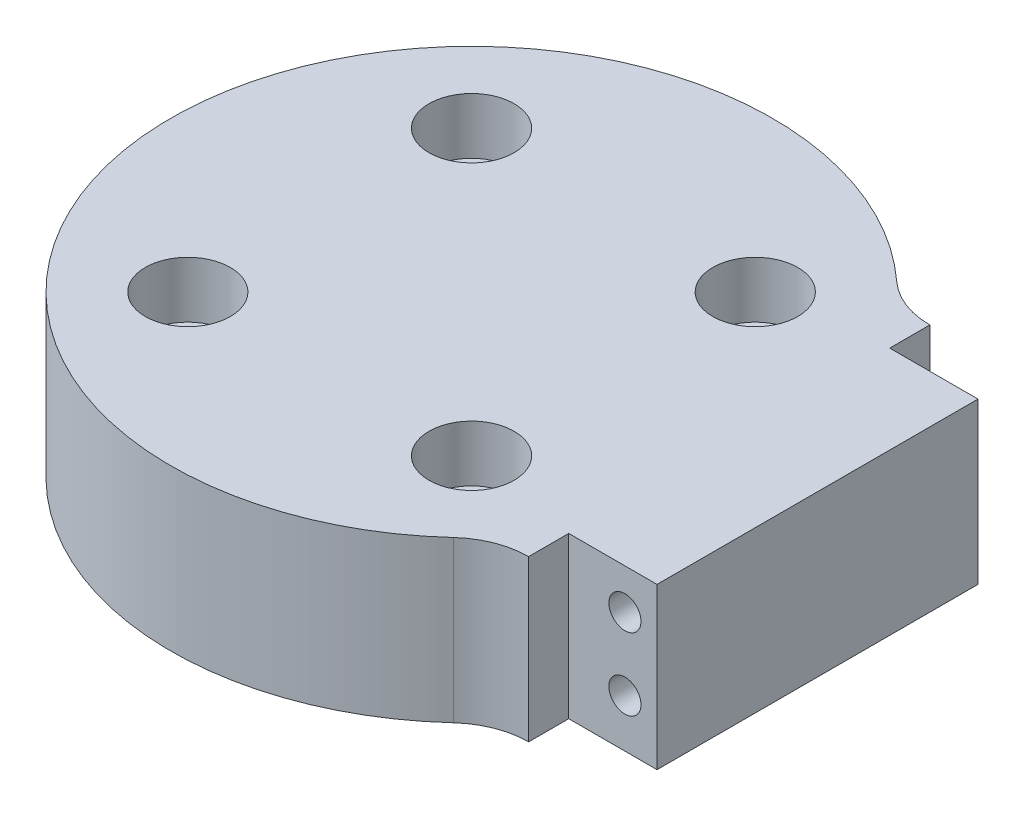
ISO-10303-21;
HEADER;
FILE_DESCRIPTION(('STEP AP214'),'2;1');
FILE_NAME('part.step','',(''),(''),'','','');
FILE_SCHEMA(('AUTOMOTIVE_DESIGN { 1 0 10303 214 1 1 1 1 }'));
ENDSEC;
DATA;
#1=APPLICATION_CONTEXT('core data for automotive mechanical design processes');
#2=APPLICATION_PROTOCOL_DEFINITION('international standard','automotive_design',2000,#1);
#3=PRODUCT_CONTEXT('',#1,'mechanical');
#4=PRODUCT('Part','Part','',(#3));
#5=PRODUCT_RELATED_PRODUCT_CATEGORY('part','',(#4));
#6=PRODUCT_DEFINITION_FORMATION('','',#4);
#7=PRODUCT_DEFINITION_CONTEXT('part definition',#1,'design');
#8=PRODUCT_DEFINITION('design','',#6,#7);
#9=PRODUCT_DEFINITION_SHAPE('','',#8);
#10=(LENGTH_UNIT() NAMED_UNIT(*) SI_UNIT(.MILLI.,.METRE.));
#11=(NAMED_UNIT(*) PLANE_ANGLE_UNIT() SI_UNIT($,.RADIAN.));
#12=(NAMED_UNIT(*) SI_UNIT($,.STERADIAN.) SOLID_ANGLE_UNIT());
#13=UNCERTAINTY_MEASURE_WITH_UNIT(LENGTH_MEASURE(1.E-05),#10,'distance_accuracy_value','');
#14=(GEOMETRIC_REPRESENTATION_CONTEXT(3) GLOBAL_UNCERTAINTY_ASSIGNED_CONTEXT((#13)) GLOBAL_UNIT_ASSIGNED_CONTEXT((#10,
#11,#12)) REPRESENTATION_CONTEXT('',''));
#15=CARTESIAN_POINT('',(0.,0.,0.));
#16=DIRECTION('',(0.,0.,1.));
#17=DIRECTION('',(1.,0.,0.));
#18=AXIS2_PLACEMENT_3D('',#15,#16,#17);
#19=CARTESIAN_POINT('',(-70.3869185533372,0.,0.));
#20=DIRECTION('',(-1.,0.,0.));
#21=DIRECTION('',(0.,0.,1.));
#22=AXIS2_PLACEMENT_3D('',#19,#20,#21);
#23=PLANE('',#22);
#24=DIRECTION('',(0.,-1.,0.));
#25=VECTOR('',#24,1.);
#26=CARTESIAN_POINT('',(-70.3869185533372,80.,20.));
#27=LINE('',#26,#25);
#28=CARTESIAN_POINT('',(-70.3869185533371,80.,20.));
#29=VERTEX_POINT('',#28);
#30=CARTESIAN_POINT('',(-70.3869185533372,60.,20.));
#31=VERTEX_POINT('',#30);
#32=EDGE_CURVE('E137',#29,#31,#27,.T.);
#33=ORIENTED_EDGE('',*,*,#32,.F.);
#34=DIRECTION('',(0.,0.,1.));
#35=VECTOR('',#34,1.);
#36=CARTESIAN_POINT('',(-70.3869185533371,80.,39.));
#37=LINE('',#36,#35);
#38=CARTESIAN_POINT('',(-70.3869185533372,80.,25.));
#39=VERTEX_POINT('',#38);
#40=EDGE_CURVE('E138',#29,#39,#37,.T.);
#41=ORIENTED_EDGE('',*,*,#40,.T.);
#42=DIRECTION('',(0.,1.,0.));
#43=VECTOR('',#42,1.);
#44=CARTESIAN_POINT('',(-70.3869185533372,80.,25.));
#45=LINE('',#44,#43);
#46=CARTESIAN_POINT('',(-70.3869185533372,60.,25.));
#47=VERTEX_POINT('',#46);
#48=EDGE_CURVE('E186',#39,#47,#45,.F.);
#49=ORIENTED_EDGE('',*,*,#48,.T.);
#50=DIRECTION('',(0.,0.,1.));
#51=VECTOR('',#50,1.);
#52=CARTESIAN_POINT('',(-70.3869185533372,60.,-25.));
#53=LINE('',#52,#51);
#54=EDGE_CURVE('E65',#31,#47,#53,.T.);
#55=ORIENTED_EDGE('',*,*,#54,.F.);
#56=EDGE_LOOP('',(#33,#41,#49,#55));
#57=FACE_BOUND('',#56,.T.);
#58=ADVANCED_FACE('F48',(#57),#23,.F.);
#59=DIRECTION('',(0.,1.,0.));
#60=VECTOR('',#59,1.);
#61=CARTESIAN_POINT('',(-70.3869185533372,80.,-20.));
#62=LINE('',#61,#60);
#63=CARTESIAN_POINT('',(-70.3869185533372,60.,-20.));
#64=VERTEX_POINT('',#63);
#65=CARTESIAN_POINT('',(-70.3869185533372,80.,-20.));
#66=VERTEX_POINT('',#65);
#67=EDGE_CURVE('E73',#64,#66,#62,.T.);
#68=ORIENTED_EDGE('',*,*,#67,.F.);
#69=CARTESIAN_POINT('',(-70.3869185533372,60.,-25.));
#70=VERTEX_POINT('',#69);
#71=EDGE_CURVE('E146',#70,#64,#53,.T.);
#72=ORIENTED_EDGE('',*,*,#71,.F.);
#73=DIRECTION('',(0.,1.,0.));
#74=VECTOR('',#73,1.);
#75=CARTESIAN_POINT('',(-70.3869185533372,80.,-25.));
#76=LINE('',#75,#74);
#77=CARTESIAN_POINT('',(-70.3869185533372,80.,-25.));
#78=VERTEX_POINT('',#77);
#79=EDGE_CURVE('E176',#70,#78,#76,.T.);
#80=ORIENTED_EDGE('',*,*,#79,.T.);
#81=EDGE_CURVE('E140',#78,#66,#37,.T.);
#82=ORIENTED_EDGE('',*,*,#81,.T.);
#83=EDGE_LOOP('',(#68,#72,#80,#82));
#84=FACE_BOUND('',#83,.T.);
#85=ADVANCED_FACE('F220',(#84),#23,.F.);
#86=CARTESIAN_POINT('',(-120.177669529664,-5.,-17.6776695296637));
#87=DIRECTION('',(0.,1.,0.));
#88=DIRECTION('',(0.,0.,1.));
#89=AXIS2_PLACEMENT_3D('',#86,#87,#88);
#90=CYLINDRICAL_SURFACE('',#89,3.25000000000001);
#91=CARTESIAN_POINT('',(-120.177669529664,60.,-17.6776695296637));
#92=DIRECTION('',(0.,1.,0.));
#93=DIRECTION('',(0.,0.,1.));
#94=AXIS2_PLACEMENT_3D('',#91,#92,#93);
#95=CIRCLE('',#94,3.25000000000001);
#96=CARTESIAN_POINT('',(-120.177669529664,60.,-14.4276695296637));
#97=VERTEX_POINT('',#96);
#98=EDGE_CURVE('E193',#97,#97,#95,.T.);
#99=ORIENTED_EDGE('',*,*,#98,.F.);
#100=EDGE_LOOP('',(#99));
#101=FACE_BOUND('',#100,.T.);
#102=CARTESIAN_POINT('',(-120.177669529664,73.,-17.6776695296637));
#103=DIRECTION('',(0.,1.,0.));
#104=DIRECTION('',(0.,0.,1.));
#105=AXIS2_PLACEMENT_3D('',#102,#103,#104);
#106=CIRCLE('',#105,3.25000000000001);
#107=CARTESIAN_POINT('',(-120.177669529664,73.,-14.4276695296637));
#108=VERTEX_POINT('',#107);
#109=EDGE_CURVE('E52',#108,#108,#106,.F.);
#110=ORIENTED_EDGE('',*,*,#109,.F.);
#111=EDGE_LOOP('',(#110));
#112=FACE_BOUND('',#111,.T.);
#113=ADVANCED_FACE('F217',(#101,#112),#90,.F.);
#114=CARTESIAN_POINT('',(-120.177669529664,-5.,17.6776695296637));
#115=DIRECTION('',(0.,1.,0.));
#116=DIRECTION('',(0.,0.,1.));
#117=AXIS2_PLACEMENT_3D('',#114,#115,#116);
#118=CYLINDRICAL_SURFACE('',#117,3.25000000000001);
#119=CARTESIAN_POINT('',(-120.177669529664,60.,17.6776695296637));
#120=DIRECTION('',(0.,1.,0.));
#121=DIRECTION('',(0.,0.,1.));
#122=AXIS2_PLACEMENT_3D('',#119,#120,#121);
#123=CIRCLE('',#122,3.25000000000001);
#124=CARTESIAN_POINT('',(-120.177669529664,60.,20.9276695296637));
#125=VERTEX_POINT('',#124);
#126=EDGE_CURVE('E196',#125,#125,#123,.T.);
#127=ORIENTED_EDGE('',*,*,#126,.F.);
#128=EDGE_LOOP('',(#127));
#129=FACE_BOUND('',#128,.T.);
#130=CARTESIAN_POINT('',(-120.177669529664,73.,17.6776695296637));
#131=DIRECTION('',(0.,1.,0.));
#132=DIRECTION('',(0.,0.,1.));
#133=AXIS2_PLACEMENT_3D('',#130,#131,#132);
#134=CIRCLE('',#133,3.25000000000001);
#135=CARTESIAN_POINT('',(-120.177669529664,73.,20.9276695296637));
#136=VERTEX_POINT('',#135);
#137=EDGE_CURVE('E208',#136,#136,#134,.F.);
#138=ORIENTED_EDGE('',*,*,#137,.F.);
#139=EDGE_LOOP('',(#138));
#140=FACE_BOUND('',#139,.T.);
#141=ADVANCED_FACE('F219',(#129,#140),#118,.F.);
#142=CARTESIAN_POINT('',(-84.8223304703363,-5.,17.6776695296637));
#143=DIRECTION('',(0.,1.,0.));
#144=DIRECTION('',(0.,0.,1.));
#145=AXIS2_PLACEMENT_3D('',#142,#143,#144);
#146=CYLINDRICAL_SURFACE('',#145,3.25000000000001);
#147=CARTESIAN_POINT('',(-84.8223304703363,60.,17.6776695296637));
#148=DIRECTION('',(0.,1.,0.));
#149=DIRECTION('',(0.,0.,1.));
#150=AXIS2_PLACEMENT_3D('',#147,#148,#149);
#151=CIRCLE('',#150,3.25000000000001);
#152=CARTESIAN_POINT('',(-84.8223304703363,60.,20.9276695296637));
#153=VERTEX_POINT('',#152);
#154=EDGE_CURVE('E199',#153,#153,#151,.T.);
#155=ORIENTED_EDGE('',*,*,#154,.F.);
#156=EDGE_LOOP('',(#155));
#157=FACE_BOUND('',#156,.T.);
#158=CARTESIAN_POINT('',(-84.8223304703363,73.,17.6776695296637));
#159=DIRECTION('',(0.,1.,0.));
#160=DIRECTION('',(0.,0.,1.));
#161=AXIS2_PLACEMENT_3D('',#158,#159,#160);
#162=CIRCLE('',#161,3.25000000000001);
#163=CARTESIAN_POINT('',(-84.8223304703363,73.,20.9276695296637));
#164=VERTEX_POINT('',#163);
#165=EDGE_CURVE('E206',#164,#164,#162,.F.);
#166=ORIENTED_EDGE('',*,*,#165,.F.);
#167=EDGE_LOOP('',(#166));
#168=FACE_BOUND('',#167,.T.);
#169=ADVANCED_FACE('F226',(#157,#168),#146,.F.);
#170=CARTESIAN_POINT('',(-84.8223304703363,-5.,-17.6776695296637));
#171=DIRECTION('',(0.,1.,0.));
#172=DIRECTION('',(0.,0.,1.));
#173=AXIS2_PLACEMENT_3D('',#170,#171,#172);
#174=CYLINDRICAL_SURFACE('',#173,3.25000000000001);
#175=CARTESIAN_POINT('',(-84.8223304703363,60.,-17.6776695296637));
#176=DIRECTION('',(0.,1.,0.));
#177=DIRECTION('',(0.,0.,1.));
#178=AXIS2_PLACEMENT_3D('',#175,#176,#177);
#179=CIRCLE('',#178,3.25000000000001);
#180=CARTESIAN_POINT('',(-84.8223304703363,60.,-14.4276695296637));
#181=VERTEX_POINT('',#180);
#182=EDGE_CURVE('E180',#181,#181,#179,.T.);
#183=ORIENTED_EDGE('',*,*,#182,.F.);
#184=EDGE_LOOP('',(#183));
#185=FACE_BOUND('',#184,.T.);
#186=CARTESIAN_POINT('',(-84.8223304703363,73.,-17.6776695296637));
#187=DIRECTION('',(0.,1.,0.));
#188=DIRECTION('',(0.,0.,1.));
#189=AXIS2_PLACEMENT_3D('',#186,#187,#188);
#190=CIRCLE('',#189,3.25000000000001);
#191=CARTESIAN_POINT('',(-84.8223304703363,73.,-14.4276695296637));
#192=VERTEX_POINT('',#191);
#193=EDGE_CURVE('E170',#192,#192,#190,.F.);
#194=ORIENTED_EDGE('',*,*,#193,.F.);
#195=EDGE_LOOP('',(#194));
#196=FACE_BOUND('',#195,.T.);
#197=ADVANCED_FACE('F273',(#185,#196),#174,.F.);
#198=CARTESIAN_POINT('',(0.,80.,0.));
#199=DIRECTION('',(0.,1.,0.));
#200=DIRECTION('',(0.,0.,1.));
#201=AXIS2_PLACEMENT_3D('',#198,#199,#200);
#202=PLANE('',#201);
#203=ORIENTED_EDGE('',*,*,#81,.F.);
#204=CARTESIAN_POINT('',(-70.3869185533372,80.,-35.));
#205=DIRECTION('',(0.,1.,0.));
#206=DIRECTION('',(0.,0.,1.));
#207=AXIS2_PLACEMENT_3D('',#204,#205,#206);
#208=CIRCLE('',#207,10.);
#209=CARTESIAN_POINT('',(-77.1475672789504,80.,-27.6315789473684));
#210=VERTEX_POINT('',#209);
#211=EDGE_CURVE('E188',#78,#210,#208,.F.);
#212=ORIENTED_EDGE('',*,*,#211,.T.);
#213=CARTESIAN_POINT('',(-102.5,80.,0.));
#214=DIRECTION('',(0.,1.,0.));
#215=DIRECTION('',(0.,0.,1.));
#216=AXIS2_PLACEMENT_3D('',#213,#214,#215);
#217=CIRCLE('',#216,37.5);
#218=CARTESIAN_POINT('',(-77.1475672789504,80.,27.6315789473684));
#219=VERTEX_POINT('',#218);
#220=EDGE_CURVE('E177',#210,#219,#217,.T.);
#221=ORIENTED_EDGE('',*,*,#220,.T.);
#222=CARTESIAN_POINT('',(-70.3869185533372,80.,35.));
#223=DIRECTION('',(0.,1.,0.));
#224=DIRECTION('',(0.,0.,1.));
#225=AXIS2_PLACEMENT_3D('',#222,#223,#224);
#226=CIRCLE('',#225,10.);
#227=EDGE_CURVE('E12',#219,#39,#226,.F.);
#228=ORIENTED_EDGE('',*,*,#227,.T.);
#229=ORIENTED_EDGE('',*,*,#40,.F.);
#230=DIRECTION('',(-1.,0.,0.));
#231=VECTOR('',#230,1.);
#232=CARTESIAN_POINT('',(-59.3869185533372,80.,20.));
#233=LINE('',#232,#231);
#234=CARTESIAN_POINT('',(-59.3869185533372,80.,20.));
#235=VERTEX_POINT('',#234);
#236=EDGE_CURVE('E334',#235,#29,#233,.T.);
#237=ORIENTED_EDGE('',*,*,#236,.F.);
#238=DIRECTION('',(0.,0.,1.));
#239=VECTOR('',#238,1.);
#240=CARTESIAN_POINT('',(-59.3869185533372,80.,20.));
#241=LINE('',#240,#239);
#242=CARTESIAN_POINT('',(-59.3869185533372,80.,-20.));
#243=VERTEX_POINT('',#242);
#244=EDGE_CURVE('E131',#243,#235,#241,.T.);
#245=ORIENTED_EDGE('',*,*,#244,.F.);
#246=DIRECTION('',(-1.,0.,0.));
#247=VECTOR('',#246,1.);
#248=CARTESIAN_POINT('',(-59.3869185533372,80.,-20.));
#249=LINE('',#248,#247);
#250=EDGE_CURVE('E142',#243,#66,#249,.T.);
#251=ORIENTED_EDGE('',*,*,#250,.T.);
#252=EDGE_LOOP('',(#203,#212,#221,#228,#229,#237,#245,#251));
#253=FACE_BOUND('',#252,.T.);
#254=CARTESIAN_POINT('',(-84.8223304703363,80.,-17.6776695296637));
#255=DIRECTION('',(0.,1.,0.));
#256=DIRECTION('',(0.,0.,1.));
#257=AXIS2_PLACEMENT_3D('',#254,#255,#256);
#258=CIRCLE('',#257,5.3);
#259=CARTESIAN_POINT('',(-84.8223304703363,80.,-12.3776695296637));
#260=VERTEX_POINT('',#259);
#261=EDGE_CURVE('E148',#260,#260,#258,.T.);
#262=ORIENTED_EDGE('',*,*,#261,.F.);
#263=EDGE_LOOP('',(#262));
#264=FACE_BOUND('',#263,.T.);
#265=CARTESIAN_POINT('',(-84.8223304703363,80.,17.6776695296637));
#266=DIRECTION('',(0.,1.,0.));
#267=DIRECTION('',(0.,0.,1.));
#268=AXIS2_PLACEMENT_3D('',#265,#266,#267);
#269=CIRCLE('',#268,5.3);
#270=CARTESIAN_POINT('',(-84.8223304703363,80.,22.9776695296637));
#271=VERTEX_POINT('',#270);
#272=EDGE_CURVE('E159',#271,#271,#269,.T.);
#273=ORIENTED_EDGE('',*,*,#272,.F.);
#274=EDGE_LOOP('',(#273));
#275=FACE_BOUND('',#274,.T.);
#276=CARTESIAN_POINT('',(-120.177669529664,80.,17.6776695296637));
#277=DIRECTION('',(0.,1.,0.));
#278=DIRECTION('',(0.,0.,1.));
#279=AXIS2_PLACEMENT_3D('',#276,#277,#278);
#280=CIRCLE('',#279,5.3);
#281=CARTESIAN_POINT('',(-120.177669529664,80.,22.9776695296637));
#282=VERTEX_POINT('',#281);
#283=EDGE_CURVE('E153',#282,#282,#280,.T.);
#284=ORIENTED_EDGE('',*,*,#283,.F.);
#285=EDGE_LOOP('',(#284));
#286=FACE_BOUND('',#285,.T.);
#287=CARTESIAN_POINT('',(-120.177669529664,80.,-17.6776695296637));
#288=DIRECTION('',(0.,1.,0.));
#289=DIRECTION('',(0.,0.,1.));
#290=AXIS2_PLACEMENT_3D('',#287,#288,#289);
#291=CIRCLE('',#290,5.3);
#292=CARTESIAN_POINT('',(-120.177669529664,80.,-12.3776695296637));
#293=VERTEX_POINT('',#292);
#294=EDGE_CURVE('E152',#293,#293,#291,.T.);
#295=ORIENTED_EDGE('',*,*,#294,.F.);
#296=EDGE_LOOP('',(#295));
#297=FACE_BOUND('',#296,.T.);
#298=ADVANCED_FACE('F276',(#253,#264,#275,#286,#297),#202,.T.);
#299=CARTESIAN_POINT('',(-140.,60.,-25.));
#300=DIRECTION('',(0.,1.,0.));
#301=DIRECTION('',(0.,0.,1.));
#302=AXIS2_PLACEMENT_3D('',#299,#300,#301);
#303=PLANE('',#302);
#304=ORIENTED_EDGE('',*,*,#182,.T.);
#305=EDGE_LOOP('',(#304));
#306=FACE_BOUND('',#305,.T.);
#307=ORIENTED_EDGE('',*,*,#154,.T.);
#308=EDGE_LOOP('',(#307));
#309=FACE_BOUND('',#308,.T.);
#310=ORIENTED_EDGE('',*,*,#126,.T.);
#311=EDGE_LOOP('',(#310));
#312=FACE_BOUND('',#311,.T.);
#313=ORIENTED_EDGE('',*,*,#98,.T.);
#314=EDGE_LOOP('',(#313));
#315=FACE_BOUND('',#314,.T.);
#316=CARTESIAN_POINT('',(-70.3869185533372,60.,-35.));
#317=DIRECTION('',(0.,1.,0.));
#318=DIRECTION('',(0.,0.,1.));
#319=AXIS2_PLACEMENT_3D('',#316,#317,#318);
#320=CIRCLE('',#319,10.);
#321=CARTESIAN_POINT('',(-77.1475672789504,60.,-27.6315789473684));
#322=VERTEX_POINT('',#321);
#323=EDGE_CURVE('E190',#322,#70,#320,.T.);
#324=ORIENTED_EDGE('',*,*,#323,.T.);
#325=ORIENTED_EDGE('',*,*,#71,.T.);
#326=DIRECTION('',(-1.,0.,0.));
#327=VECTOR('',#326,1.);
#328=CARTESIAN_POINT('',(-59.3869185533372,60.,-20.));
#329=LINE('',#328,#327);
#330=CARTESIAN_POINT('',(-59.3869185533372,60.,-20.));
#331=VERTEX_POINT('',#330);
#332=EDGE_CURVE('E122',#331,#64,#329,.T.);
#333=ORIENTED_EDGE('',*,*,#332,.F.);
#334=DIRECTION('',(0.,0.,-1.));
#335=VECTOR('',#334,1.);
#336=CARTESIAN_POINT('',(-59.3869185533372,60.,20.));
#337=LINE('',#336,#335);
#338=CARTESIAN_POINT('',(-59.3869185533372,60.,20.));
#339=VERTEX_POINT('',#338);
#340=EDGE_CURVE('E114',#339,#331,#337,.T.);
#341=ORIENTED_EDGE('',*,*,#340,.F.);
#342=DIRECTION('',(-1.,0.,0.));
#343=VECTOR('',#342,1.);
#344=CARTESIAN_POINT('',(-59.3869185533372,60.,20.));
#345=LINE('',#344,#343);
#346=EDGE_CURVE('E119',#339,#31,#345,.T.);
#347=ORIENTED_EDGE('',*,*,#346,.T.);
#348=ORIENTED_EDGE('',*,*,#54,.T.);
#349=CARTESIAN_POINT('',(-70.3869185533372,60.,35.));
#350=DIRECTION('',(0.,1.,0.));
#351=DIRECTION('',(0.,0.,1.));
#352=AXIS2_PLACEMENT_3D('',#349,#350,#351);
#353=CIRCLE('',#352,10.);
#354=CARTESIAN_POINT('',(-77.1475672789504,60.,27.6315789473684));
#355=VERTEX_POINT('',#354);
#356=EDGE_CURVE('E57',#47,#355,#353,.T.);
#357=ORIENTED_EDGE('',*,*,#356,.T.);
#358=CARTESIAN_POINT('',(-102.5,60.,0.));
#359=DIRECTION('',(0.,1.,0.));
#360=DIRECTION('',(0.,0.,1.));
#361=AXIS2_PLACEMENT_3D('',#358,#359,#360);
#362=CIRCLE('',#361,37.5);
#363=EDGE_CURVE('E173',#355,#322,#362,.F.);
#364=ORIENTED_EDGE('',*,*,#363,.T.);
#365=EDGE_LOOP('',(#324,#325,#333,#341,#347,#348,#357,#364));
#366=FACE_BOUND('',#365,.T.);
#367=ADVANCED_FACE('F117',(#306,#309,#312,#315,#366),#303,.F.);
#368=CARTESIAN_POINT('',(-102.5,-46.0660171779822,0.));
#369=DIRECTION('',(0.,1.,0.));
#370=DIRECTION('',(0.,0.,1.));
#371=AXIS2_PLACEMENT_3D('',#368,#369,#370);
#372=CYLINDRICAL_SURFACE('',#371,37.5);
#373=ORIENTED_EDGE('',*,*,#220,.F.);
#374=DIRECTION('',(0.,1.,0.));
#375=VECTOR('',#374,1.);
#376=CARTESIAN_POINT('',(-77.1475672789504,-46.0660171779822,-27.6315789473684));
#377=LINE('',#376,#375);
#378=EDGE_CURVE('E184',#210,#322,#377,.F.);
#379=ORIENTED_EDGE('',*,*,#378,.T.);
#380=ORIENTED_EDGE('',*,*,#363,.F.);
#381=DIRECTION('',(0.,1.,0.));
#382=VECTOR('',#381,1.);
#383=CARTESIAN_POINT('',(-77.1475672789504,-46.0660171779822,27.6315789473684));
#384=LINE('',#383,#382);
#385=EDGE_CURVE('E182',#355,#219,#384,.T.);
#386=ORIENTED_EDGE('',*,*,#385,.T.);
#387=EDGE_LOOP('',(#373,#379,#380,#386));
#388=FACE_BOUND('',#387,.T.);
#389=ADVANCED_FACE('F291',(#388),#372,.T.);
#390=CARTESIAN_POINT('',(-70.3869185533372,-46.0660171779822,-35.));
#391=DIRECTION('',(0.,1.,0.));
#392=DIRECTION('',(0.,0.,1.));
#393=AXIS2_PLACEMENT_3D('',#390,#391,#392);
#394=CYLINDRICAL_SURFACE('',#393,10.);
#395=ORIENTED_EDGE('',*,*,#323,.F.);
#396=ORIENTED_EDGE('',*,*,#378,.F.);
#397=ORIENTED_EDGE('',*,*,#211,.F.);
#398=ORIENTED_EDGE('',*,*,#79,.F.);
#399=EDGE_LOOP('',(#395,#396,#397,#398));
#400=FACE_BOUND('',#399,.T.);
#401=ADVANCED_FACE('F304',(#400),#394,.F.);
#402=CARTESIAN_POINT('',(-70.3869185533372,-46.0660171779822,35.));
#403=DIRECTION('',(0.,1.,0.));
#404=DIRECTION('',(0.,0.,1.));
#405=AXIS2_PLACEMENT_3D('',#402,#403,#404);
#406=CYLINDRICAL_SURFACE('',#405,10.);
#407=ORIENTED_EDGE('',*,*,#227,.F.);
#408=ORIENTED_EDGE('',*,*,#385,.F.);
#409=ORIENTED_EDGE('',*,*,#356,.F.);
#410=ORIENTED_EDGE('',*,*,#48,.F.);
#411=EDGE_LOOP('',(#407,#408,#409,#410));
#412=FACE_BOUND('',#411,.T.);
#413=ADVANCED_FACE('F50',(#412),#406,.F.);
#414=CARTESIAN_POINT('',(-84.8223304703363,73.,-17.6776695296637));
#415=DIRECTION('',(0.,1.,0.));
#416=DIRECTION('',(0.,0.,1.));
#417=AXIS2_PLACEMENT_3D('',#414,#415,#416);
#418=PLANE('',#417);
#419=CARTESIAN_POINT('',(-84.8223304703363,73.,-17.6776695296637));
#420=DIRECTION('',(0.,1.,0.));
#421=DIRECTION('',(0.,0.,1.));
#422=AXIS2_PLACEMENT_3D('',#419,#420,#421);
#423=CIRCLE('',#422,5.3);
#424=CARTESIAN_POINT('',(-84.8223304703363,73.,-12.3776695296637));
#425=VERTEX_POINT('',#424);
#426=EDGE_CURVE('E162',#425,#425,#423,.T.);
#427=ORIENTED_EDGE('',*,*,#426,.T.);
#428=EDGE_LOOP('',(#427));
#429=FACE_BOUND('',#428,.T.);
#430=ORIENTED_EDGE('',*,*,#193,.T.);
#431=EDGE_LOOP('',(#430));
#432=FACE_BOUND('',#431,.T.);
#433=ADVANCED_FACE('F258',(#429,#432),#418,.T.);
#434=CARTESIAN_POINT('',(-84.8223304703363,73.,-17.6776695296637));
#435=DIRECTION('',(0.,1.,0.));
#436=DIRECTION('',(0.,0.,1.));
#437=AXIS2_PLACEMENT_3D('',#434,#435,#436);
#438=CYLINDRICAL_SURFACE('',#437,5.3);
#439=ORIENTED_EDGE('',*,*,#426,.F.);
#440=EDGE_LOOP('',(#439));
#441=FACE_BOUND('',#440,.T.);
#442=ORIENTED_EDGE('',*,*,#261,.T.);
#443=EDGE_LOOP('',(#442));
#444=FACE_BOUND('',#443,.T.);
#445=ADVANCED_FACE('F253',(#441,#444),#438,.F.);
#446=CARTESIAN_POINT('',(-84.8223304703363,73.,17.6776695296637));
#447=DIRECTION('',(0.,1.,0.));
#448=DIRECTION('',(0.,0.,1.));
#449=AXIS2_PLACEMENT_3D('',#446,#447,#448);
#450=PLANE('',#449);
#451=CARTESIAN_POINT('',(-84.8223304703363,73.,17.6776695296637));
#452=DIRECTION('',(0.,1.,0.));
#453=DIRECTION('',(0.,0.,1.));
#454=AXIS2_PLACEMENT_3D('',#451,#452,#453);
#455=CIRCLE('',#454,5.3);
#456=CARTESIAN_POINT('',(-84.8223304703363,73.,22.9776695296637));
#457=VERTEX_POINT('',#456);
#458=EDGE_CURVE('E156',#457,#457,#455,.T.);
#459=ORIENTED_EDGE('',*,*,#458,.T.);
#460=EDGE_LOOP('',(#459));
#461=FACE_BOUND('',#460,.T.);
#462=ORIENTED_EDGE('',*,*,#165,.T.);
#463=EDGE_LOOP('',(#462));
#464=FACE_BOUND('',#463,.T.);
#465=ADVANCED_FACE('F250',(#461,#464),#450,.T.);
#466=CARTESIAN_POINT('',(-84.8223304703363,73.,17.6776695296637));
#467=DIRECTION('',(0.,1.,0.));
#468=DIRECTION('',(0.,0.,1.));
#469=AXIS2_PLACEMENT_3D('',#466,#467,#468);
#470=CYLINDRICAL_SURFACE('',#469,5.3);
#471=ORIENTED_EDGE('',*,*,#458,.F.);
#472=EDGE_LOOP('',(#471));
#473=FACE_BOUND('',#472,.T.);
#474=ORIENTED_EDGE('',*,*,#272,.T.);
#475=EDGE_LOOP('',(#474));
#476=FACE_BOUND('',#475,.T.);
#477=ADVANCED_FACE('F245',(#473,#476),#470,.F.);
#478=CARTESIAN_POINT('',(-120.177669529664,73.,17.6776695296637));
#479=DIRECTION('',(0.,1.,0.));
#480=DIRECTION('',(0.,0.,1.));
#481=AXIS2_PLACEMENT_3D('',#478,#479,#480);
#482=PLANE('',#481);
#483=CARTESIAN_POINT('',(-120.177669529664,73.,17.6776695296637));
#484=DIRECTION('',(0.,1.,0.));
#485=DIRECTION('',(0.,0.,1.));
#486=AXIS2_PLACEMENT_3D('',#483,#484,#485);
#487=CIRCLE('',#486,5.3);
#488=CARTESIAN_POINT('',(-120.177669529664,73.,22.9776695296637));
#489=VERTEX_POINT('',#488);
#490=EDGE_CURVE('E149',#489,#489,#487,.T.);
#491=ORIENTED_EDGE('',*,*,#490,.T.);
#492=EDGE_LOOP('',(#491));
#493=FACE_BOUND('',#492,.T.);
#494=ORIENTED_EDGE('',*,*,#137,.T.);
#495=EDGE_LOOP('',(#494));
#496=FACE_BOUND('',#495,.T.);
#497=ADVANCED_FACE('F241',(#493,#496),#482,.T.);
#498=CARTESIAN_POINT('',(-120.177669529664,73.,17.6776695296637));
#499=DIRECTION('',(0.,1.,0.));
#500=DIRECTION('',(0.,0.,1.));
#501=AXIS2_PLACEMENT_3D('',#498,#499,#500);
#502=CYLINDRICAL_SURFACE('',#501,5.3);
#503=ORIENTED_EDGE('',*,*,#490,.F.);
#504=EDGE_LOOP('',(#503));
#505=FACE_BOUND('',#504,.T.);
#506=ORIENTED_EDGE('',*,*,#283,.T.);
#507=EDGE_LOOP('',(#506));
#508=FACE_BOUND('',#507,.T.);
#509=ADVANCED_FACE('F244',(#505,#508),#502,.F.);
#510=CARTESIAN_POINT('',(-120.177669529664,73.,-17.6776695296637));
#511=DIRECTION('',(0.,1.,0.));
#512=DIRECTION('',(0.,0.,1.));
#513=AXIS2_PLACEMENT_3D('',#510,#511,#512);
#514=PLANE('',#513);
#515=CARTESIAN_POINT('',(-120.177669529664,73.,-17.6776695296637));
#516=DIRECTION('',(0.,1.,0.));
#517=DIRECTION('',(0.,0.,1.));
#518=AXIS2_PLACEMENT_3D('',#515,#516,#517);
#519=CIRCLE('',#518,5.3);
#520=CARTESIAN_POINT('',(-120.177669529664,73.,-12.3776695296637));
#521=VERTEX_POINT('',#520);
#522=EDGE_CURVE('E167',#521,#521,#519,.T.);
#523=ORIENTED_EDGE('',*,*,#522,.T.);
#524=EDGE_LOOP('',(#523));
#525=FACE_BOUND('',#524,.T.);
#526=ORIENTED_EDGE('',*,*,#109,.T.);
#527=EDGE_LOOP('',(#526));
#528=FACE_BOUND('',#527,.T.);
#529=ADVANCED_FACE('F215',(#525,#528),#514,.T.);
#530=CARTESIAN_POINT('',(-120.177669529664,73.,-17.6776695296637));
#531=DIRECTION('',(0.,1.,0.));
#532=DIRECTION('',(0.,0.,1.));
#533=AXIS2_PLACEMENT_3D('',#530,#531,#532);
#534=CYLINDRICAL_SURFACE('',#533,5.3);
#535=ORIENTED_EDGE('',*,*,#522,.F.);
#536=EDGE_LOOP('',(#535));
#537=FACE_BOUND('',#536,.T.);
#538=ORIENTED_EDGE('',*,*,#294,.T.);
#539=EDGE_LOOP('',(#538));
#540=FACE_BOUND('',#539,.T.);
#541=ADVANCED_FACE('F267',(#537,#540),#534,.F.);
#542=CARTESIAN_POINT('',(-59.3869185533372,80.,20.));
#543=DIRECTION('',(0.,0.,-1.));
#544=DIRECTION('',(0.,1.,0.));
#545=AXIS2_PLACEMENT_3D('',#542,#543,#544);
#546=PLANE('',#545);
#547=CARTESIAN_POINT('',(-63.3869185533372,75.,20.));
#548=DIRECTION('',(0.,0.,1.));
#549=DIRECTION('',(1.,0.,0.));
#550=AXIS2_PLACEMENT_3D('',#547,#548,#549);
#551=CIRCLE('',#550,2.);
#552=CARTESIAN_POINT('',(-61.3869185533372,75.,20.));
#553=VERTEX_POINT('',#552);
#554=EDGE_CURVE('E344',#553,#553,#551,.T.);
#555=ORIENTED_EDGE('',*,*,#554,.F.);
#556=EDGE_LOOP('',(#555));
#557=FACE_BOUND('',#556,.T.);
#558=CARTESIAN_POINT('',(-63.3869185533372,66.,20.));
#559=DIRECTION('',(0.,0.,1.));
#560=DIRECTION('',(1.,0.,0.));
#561=AXIS2_PLACEMENT_3D('',#558,#559,#560);
#562=CIRCLE('',#561,2.);
#563=CARTESIAN_POINT('',(-61.3869185533372,66.,20.));
#564=VERTEX_POINT('',#563);
#565=EDGE_CURVE('E337',#564,#564,#562,.T.);
#566=ORIENTED_EDGE('',*,*,#565,.F.);
#567=EDGE_LOOP('',(#566));
#568=FACE_BOUND('',#567,.T.);
#569=ORIENTED_EDGE('',*,*,#32,.T.);
#570=ORIENTED_EDGE('',*,*,#346,.F.);
#571=DIRECTION('',(0.,-1.,0.));
#572=VECTOR('',#571,1.);
#573=CARTESIAN_POINT('',(-59.3869185533372,80.,20.));
#574=LINE('',#573,#572);
#575=EDGE_CURVE('E126',#235,#339,#574,.T.);
#576=ORIENTED_EDGE('',*,*,#575,.F.);
#577=ORIENTED_EDGE('',*,*,#236,.T.);
#578=EDGE_LOOP('',(#569,#570,#576,#577));
#579=FACE_BOUND('',#578,.T.);
#580=ADVANCED_FACE('F136',(#557,#568,#579),#546,.F.);
#581=CARTESIAN_POINT('',(-59.3869185533372,80.,-20.));
#582=DIRECTION('',(0.,0.,1.));
#583=DIRECTION('',(0.,-1.,0.));
#584=AXIS2_PLACEMENT_3D('',#581,#582,#583);
#585=PLANE('',#584);
#586=CARTESIAN_POINT('',(-63.3869185533372,75.,-20.));
#587=DIRECTION('',(0.,0.,-1.));
#588=DIRECTION('',(0.,1.,0.));
#589=AXIS2_PLACEMENT_3D('',#586,#587,#588);
#590=CIRCLE('',#589,2.);
#591=CARTESIAN_POINT('',(-63.3869185533372,77.,-20.));
#592=VERTEX_POINT('',#591);
#593=EDGE_CURVE('E355',#592,#592,#590,.T.);
#594=ORIENTED_EDGE('',*,*,#593,.F.);
#595=EDGE_LOOP('',(#594));
#596=FACE_BOUND('',#595,.T.);
#597=CARTESIAN_POINT('',(-63.3869185533372,66.,-20.));
#598=DIRECTION('',(0.,0.,-1.));
#599=DIRECTION('',(0.,1.,0.));
#600=AXIS2_PLACEMENT_3D('',#597,#598,#599);
#601=CIRCLE('',#600,2.);
#602=CARTESIAN_POINT('',(-63.3869185533372,68.,-20.));
#603=VERTEX_POINT('',#602);
#604=EDGE_CURVE('E349',#603,#603,#601,.T.);
#605=ORIENTED_EDGE('',*,*,#604,.F.);
#606=EDGE_LOOP('',(#605));
#607=FACE_BOUND('',#606,.T.);
#608=ORIENTED_EDGE('',*,*,#67,.T.);
#609=ORIENTED_EDGE('',*,*,#250,.F.);
#610=DIRECTION('',(0.,1.,0.));
#611=VECTOR('',#610,1.);
#612=CARTESIAN_POINT('',(-59.3869185533372,80.,-20.));
#613=LINE('',#612,#611);
#614=EDGE_CURVE('E125',#331,#243,#613,.T.);
#615=ORIENTED_EDGE('',*,*,#614,.F.);
#616=ORIENTED_EDGE('',*,*,#332,.T.);
#617=EDGE_LOOP('',(#608,#609,#615,#616));
#618=FACE_BOUND('',#617,.T.);
#619=ADVANCED_FACE('F328',(#596,#607,#618),#585,.F.);
#620=CARTESIAN_POINT('',(-59.3869185533372,0.,0.));
#621=DIRECTION('',(1.,0.,0.));
#622=DIRECTION('',(0.,0.,-1.));
#623=AXIS2_PLACEMENT_3D('',#620,#621,#622);
#624=PLANE('',#623);
#625=ORIENTED_EDGE('',*,*,#575,.T.);
#626=ORIENTED_EDGE('',*,*,#340,.T.);
#627=ORIENTED_EDGE('',*,*,#614,.T.);
#628=ORIENTED_EDGE('',*,*,#244,.T.);
#629=EDGE_LOOP('',(#625,#626,#627,#628));
#630=FACE_BOUND('',#629,.T.);
#631=ADVANCED_FACE('F129',(#630),#624,.T.);
#632=CARTESIAN_POINT('',(-63.3869185533372,66.,11.));
#633=DIRECTION('',(0.,0.,1.));
#634=DIRECTION('',(1.,0.,0.));
#635=AXIS2_PLACEMENT_3D('',#632,#633,#634);
#636=CYLINDRICAL_SURFACE('',#635,2.);
#637=CARTESIAN_POINT('',(-63.3869185533372,66.,11.));
#638=DIRECTION('',(0.,0.,1.));
#639=DIRECTION('',(1.,0.,0.));
#640=AXIS2_PLACEMENT_3D('',#637,#638,#639);
#641=CIRCLE('',#640,2.);
#642=CARTESIAN_POINT('',(-61.3869185533372,66.,11.));
#643=VERTEX_POINT('',#642);
#644=EDGE_CURVE('E340',#643,#643,#641,.T.);
#645=ORIENTED_EDGE('',*,*,#644,.F.);
#646=EDGE_LOOP('',(#645));
#647=FACE_BOUND('',#646,.T.);
#648=ORIENTED_EDGE('',*,*,#565,.T.);
#649=EDGE_LOOP('',(#648));
#650=FACE_BOUND('',#649,.T.);
#651=ADVANCED_FACE('F396',(#647,#650),#636,.F.);
#652=CARTESIAN_POINT('',(-63.3869185533372,66.,11.));
#653=DIRECTION('',(0.,0.,1.));
#654=DIRECTION('',(1.,0.,0.));
#655=AXIS2_PLACEMENT_3D('',#652,#653,#654);
#656=PLANE('',#655);
#657=ORIENTED_EDGE('',*,*,#644,.T.);
#658=EDGE_LOOP('',(#657));
#659=FACE_BOUND('',#658,.T.);
#660=ADVANCED_FACE('F392',(#659),#656,.T.);
#661=CARTESIAN_POINT('',(-63.3869185533372,75.,11.));
#662=DIRECTION('',(0.,0.,1.));
#663=DIRECTION('',(1.,0.,0.));
#664=AXIS2_PLACEMENT_3D('',#661,#662,#663);
#665=CYLINDRICAL_SURFACE('',#664,2.);
#666=CARTESIAN_POINT('',(-63.3869185533372,75.,11.));
#667=DIRECTION('',(0.,0.,1.));
#668=DIRECTION('',(1.,0.,0.));
#669=AXIS2_PLACEMENT_3D('',#666,#667,#668);
#670=CIRCLE('',#669,2.);
#671=CARTESIAN_POINT('',(-61.3869185533372,75.,11.));
#672=VERTEX_POINT('',#671);
#673=EDGE_CURVE('E330',#672,#672,#670,.T.);
#674=ORIENTED_EDGE('',*,*,#673,.F.);
#675=EDGE_LOOP('',(#674));
#676=FACE_BOUND('',#675,.T.);
#677=ORIENTED_EDGE('',*,*,#554,.T.);
#678=EDGE_LOOP('',(#677));
#679=FACE_BOUND('',#678,.T.);
#680=ADVANCED_FACE('F385',(#676,#679),#665,.F.);
#681=CARTESIAN_POINT('',(-63.3869185533372,75.,11.));
#682=DIRECTION('',(0.,0.,1.));
#683=DIRECTION('',(1.,0.,0.));
#684=AXIS2_PLACEMENT_3D('',#681,#682,#683);
#685=PLANE('',#684);
#686=ORIENTED_EDGE('',*,*,#673,.T.);
#687=EDGE_LOOP('',(#686));
#688=FACE_BOUND('',#687,.T.);
#689=ADVANCED_FACE('F376',(#688),#685,.T.);
#690=CARTESIAN_POINT('',(-63.3869185533372,66.,-11.));
#691=DIRECTION('',(0.,0.,-1.));
#692=DIRECTION('',(0.,1.,0.));
#693=AXIS2_PLACEMENT_3D('',#690,#691,#692);
#694=CYLINDRICAL_SURFACE('',#693,2.);
#695=CARTESIAN_POINT('',(-63.3869185533372,66.,-11.));
#696=DIRECTION('',(0.,0.,-1.));
#697=DIRECTION('',(0.,1.,0.));
#698=AXIS2_PLACEMENT_3D('',#695,#696,#697);
#699=CIRCLE('',#698,2.);
#700=CARTESIAN_POINT('',(-63.3869185533372,68.,-11.));
#701=VERTEX_POINT('',#700);
#702=EDGE_CURVE('E352',#701,#701,#699,.T.);
#703=ORIENTED_EDGE('',*,*,#702,.F.);
#704=EDGE_LOOP('',(#703));
#705=FACE_BOUND('',#704,.T.);
#706=ORIENTED_EDGE('',*,*,#604,.T.);
#707=EDGE_LOOP('',(#706));
#708=FACE_BOUND('',#707,.T.);
#709=ADVANCED_FACE('F374',(#705,#708),#694,.F.);
#710=CARTESIAN_POINT('',(-63.3869185533372,66.,-11.));
#711=DIRECTION('',(0.,0.,-1.));
#712=DIRECTION('',(0.,1.,0.));
#713=AXIS2_PLACEMENT_3D('',#710,#711,#712);
#714=PLANE('',#713);
#715=ORIENTED_EDGE('',*,*,#702,.T.);
#716=EDGE_LOOP('',(#715));
#717=FACE_BOUND('',#716,.T.);
#718=ADVANCED_FACE('F366',(#717),#714,.T.);
#719=CARTESIAN_POINT('',(-63.3869185533372,75.,-11.));
#720=DIRECTION('',(0.,0.,-1.));
#721=DIRECTION('',(0.,1.,0.));
#722=AXIS2_PLACEMENT_3D('',#719,#720,#721);
#723=CYLINDRICAL_SURFACE('',#722,2.);
#724=CARTESIAN_POINT('',(-63.3869185533372,75.,-11.));
#725=DIRECTION('',(0.,0.,-1.));
#726=DIRECTION('',(0.,1.,0.));
#727=AXIS2_PLACEMENT_3D('',#724,#725,#726);
#728=CIRCLE('',#727,2.);
#729=CARTESIAN_POINT('',(-63.3869185533372,77.,-11.));
#730=VERTEX_POINT('',#729);
#731=EDGE_CURVE('E341',#730,#730,#728,.T.);
#732=ORIENTED_EDGE('',*,*,#731,.F.);
#733=EDGE_LOOP('',(#732));
#734=FACE_BOUND('',#733,.T.);
#735=ORIENTED_EDGE('',*,*,#593,.T.);
#736=EDGE_LOOP('',(#735));
#737=FACE_BOUND('',#736,.T.);
#738=ADVANCED_FACE('F363',(#734,#737),#723,.F.);
#739=CARTESIAN_POINT('',(-63.3869185533372,75.,-11.));
#740=DIRECTION('',(0.,0.,-1.));
#741=DIRECTION('',(0.,1.,0.));
#742=AXIS2_PLACEMENT_3D('',#739,#740,#741);
#743=PLANE('',#742);
#744=ORIENTED_EDGE('',*,*,#731,.T.);
#745=EDGE_LOOP('',(#744));
#746=FACE_BOUND('',#745,.T.);
#747=ADVANCED_FACE('F361',(#746),#743,.T.);
#748=CLOSED_SHELL('',(#58,#85,#113,#141,#169,#197,#298,#367,#389,#401,#413,#433,#445,#465,#477,
#497,#509,#529,#541,#580,#619,#631,#651,#660,#680,#689,#709,#718,#738,#747));
#749=MANIFOLD_SOLID_BREP('B2',#748);
#750=ADVANCED_BREP_SHAPE_REPRESENTATION('',(#18,#749),#14);
#751=SHAPE_DEFINITION_REPRESENTATION(#9,#750);
ENDSEC;
END-ISO-10303-21;
